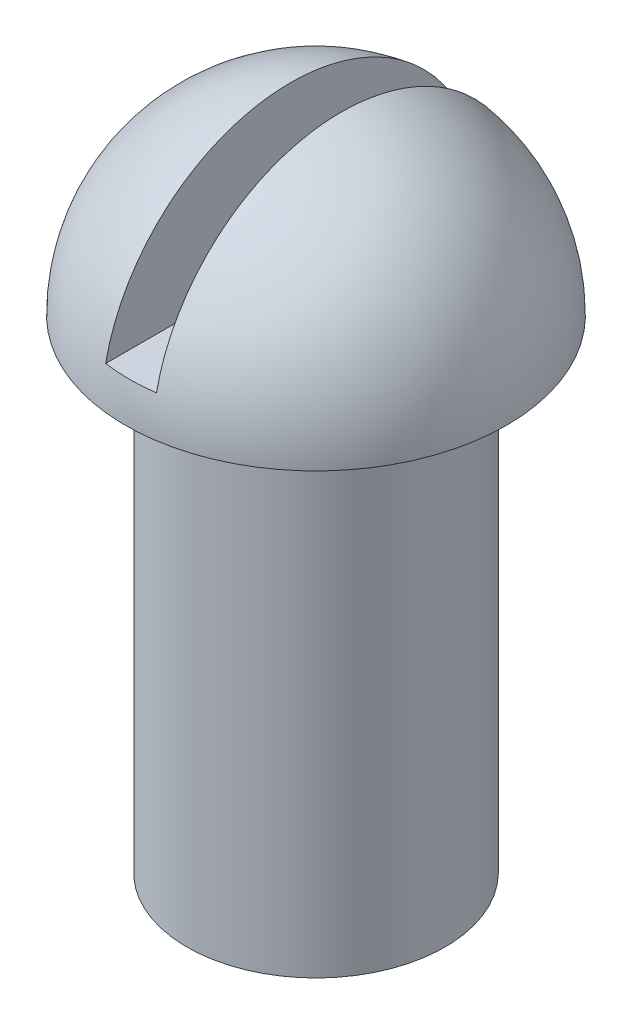
ISO-10303-21;
HEADER;
FILE_DESCRIPTION(('STEP AP214'),'2;1');
FILE_NAME('part.step','',(''),(''),'','','');
FILE_SCHEMA(('AUTOMOTIVE_DESIGN { 1 0 10303 214 1 1 1 1 }'));
ENDSEC;
DATA;
#1=APPLICATION_CONTEXT('core data for automotive mechanical design processes');
#2=APPLICATION_PROTOCOL_DEFINITION('international standard','automotive_design',2000,#1);
#3=PRODUCT_CONTEXT('',#1,'mechanical');
#4=PRODUCT('Part','Part','',(#3));
#5=PRODUCT_RELATED_PRODUCT_CATEGORY('part','',(#4));
#6=PRODUCT_DEFINITION_FORMATION('','',#4);
#7=PRODUCT_DEFINITION_CONTEXT('part definition',#1,'design');
#8=PRODUCT_DEFINITION('design','',#6,#7);
#9=PRODUCT_DEFINITION_SHAPE('','',#8);
#10=(LENGTH_UNIT() NAMED_UNIT(*) SI_UNIT(.MILLI.,.METRE.));
#11=(NAMED_UNIT(*) PLANE_ANGLE_UNIT() SI_UNIT($,.RADIAN.));
#12=(NAMED_UNIT(*) SI_UNIT($,.STERADIAN.) SOLID_ANGLE_UNIT());
#13=UNCERTAINTY_MEASURE_WITH_UNIT(LENGTH_MEASURE(1.E-05),#10,'distance_accuracy_value','');
#14=(GEOMETRIC_REPRESENTATION_CONTEXT(3) GLOBAL_UNCERTAINTY_ASSIGNED_CONTEXT((#13)) GLOBAL_UNIT_ASSIGNED_CONTEXT((#10,
#11,#12)) REPRESENTATION_CONTEXT('',''));
#15=CARTESIAN_POINT('',(0.,0.,0.));
#16=DIRECTION('',(0.,0.,1.));
#17=DIRECTION('',(1.,0.,0.));
#18=AXIS2_PLACEMENT_3D('',#15,#16,#17);
#19=CARTESIAN_POINT('',(0.,38.,0.));
#20=DIRECTION('',(0.,1.,0.));
#21=DIRECTION('',(1.,0.,0.));
#22=AXIS2_PLACEMENT_3D('',#19,#20,#21);
#23=SPHERICAL_SURFACE('',#22,15.);
#24=CARTESIAN_POINT('',(2.,38.,0.));
#25=DIRECTION('',(1.,0.,0.));
#26=DIRECTION('',(0.,0.,-1.));
#27=AXIS2_PLACEMENT_3D('',#24,#25,#26);
#28=CIRCLE('',#27,14.8660687473185);
#29=CARTESIAN_POINT('',(2.,41.,-14.560219778561));
#30=VERTEX_POINT('',#29);
#31=CARTESIAN_POINT('',(2.,41.,14.560219778561));
#32=VERTEX_POINT('',#31);
#33=EDGE_CURVE('E76',#30,#32,#28,.T.);
#34=ORIENTED_EDGE('',*,*,#33,.T.);
#35=CARTESIAN_POINT('',(0.,41.,0.));
#36=DIRECTION('',(0.,-1.,0.));
#37=DIRECTION('',(0.,0.,-1.));
#38=AXIS2_PLACEMENT_3D('',#35,#36,#37);
#39=CIRCLE('',#38,14.6969384566991);
#40=CARTESIAN_POINT('',(-2.,41.,14.560219778561));
#41=VERTEX_POINT('',#40);
#42=EDGE_CURVE('E11',#32,#41,#39,.T.);
#43=ORIENTED_EDGE('',*,*,#42,.T.);
#44=CARTESIAN_POINT('',(-2.,38.,0.));
#45=DIRECTION('',(-1.,0.,0.));
#46=DIRECTION('',(0.,0.,1.));
#47=AXIS2_PLACEMENT_3D('',#44,#45,#46);
#48=CIRCLE('',#47,14.8660687473185);
#49=CARTESIAN_POINT('',(-2.,41.,-14.560219778561));
#50=VERTEX_POINT('',#49);
#51=EDGE_CURVE('E48',#41,#50,#48,.T.);
#52=ORIENTED_EDGE('',*,*,#51,.T.);
#53=EDGE_CURVE('E55',#50,#30,#39,.T.);
#54=ORIENTED_EDGE('',*,*,#53,.T.);
#55=EDGE_LOOP('',(#34,#43,#52,#54));
#56=FACE_BOUND('',#55,.T.);
#57=CARTESIAN_POINT('',(0.,38.,0.));
#58=DIRECTION('',(0.,1.,0.));
#59=DIRECTION('',(-1.,0.,0.));
#60=AXIS2_PLACEMENT_3D('',#57,#58,#59);
#61=CIRCLE('',#60,15.);
#62=CARTESIAN_POINT('',(-15.,38.,0.));
#63=VERTEX_POINT('',#62);
#64=EDGE_CURVE('E84',#63,#63,#61,.T.);
#65=ORIENTED_EDGE('',*,*,#64,.T.);
#66=EDGE_LOOP('',(#65));
#67=FACE_BOUND('',#66,.T.);
#68=ADVANCED_FACE('F45',(#56,#67),#23,.T.);
#69=CARTESIAN_POINT('',(10.15,0.,0.));
#70=DIRECTION('',(0.,1.,0.));
#71=DIRECTION('',(-1.,0.,0.));
#72=AXIS2_PLACEMENT_3D('',#69,#70,#71);
#73=PLANE('',#72);
#74=CARTESIAN_POINT('',(0.,0.,0.));
#75=DIRECTION('',(0.,1.,0.));
#76=DIRECTION('',(-1.,0.,0.));
#77=AXIS2_PLACEMENT_3D('',#74,#75,#76);
#78=CIRCLE('',#77,10.15);
#79=CARTESIAN_POINT('',(-10.15,0.,0.));
#80=VERTEX_POINT('',#79);
#81=EDGE_CURVE('E96',#80,#80,#78,.T.);
#82=ORIENTED_EDGE('',*,*,#81,.F.);
#83=EDGE_LOOP('',(#82));
#84=FACE_BOUND('',#83,.T.);
#85=ADVANCED_FACE('F105',(#84),#73,.F.);
#86=CARTESIAN_POINT('',(0.,53.,0.));
#87=DIRECTION('',(0.,1.,0.));
#88=DIRECTION('',(-1.,0.,0.));
#89=AXIS2_PLACEMENT_3D('',#86,#87,#88);
#90=CYLINDRICAL_SURFACE('',#89,10.15);
#91=CARTESIAN_POINT('',(0.,38.,0.));
#92=DIRECTION('',(0.,1.,0.));
#93=DIRECTION('',(-1.,0.,0.));
#94=AXIS2_PLACEMENT_3D('',#91,#92,#93);
#95=CIRCLE('',#94,10.15);
#96=CARTESIAN_POINT('',(-10.15,38.,0.));
#97=VERTEX_POINT('',#96);
#98=EDGE_CURVE('E89',#97,#97,#95,.T.);
#99=ORIENTED_EDGE('',*,*,#98,.F.);
#100=EDGE_LOOP('',(#99));
#101=FACE_BOUND('',#100,.T.);
#102=ORIENTED_EDGE('',*,*,#81,.T.);
#103=EDGE_LOOP('',(#102));
#104=FACE_BOUND('',#103,.T.);
#105=ADVANCED_FACE('F103',(#101,#104),#90,.T.);
#106=CARTESIAN_POINT('',(15.,38.,0.));
#107=DIRECTION('',(0.,1.,0.));
#108=DIRECTION('',(-1.,0.,0.));
#109=AXIS2_PLACEMENT_3D('',#106,#107,#108);
#110=PLANE('',#109);
#111=ORIENTED_EDGE('',*,*,#64,.F.);
#112=EDGE_LOOP('',(#111));
#113=FACE_BOUND('',#112,.T.);
#114=ORIENTED_EDGE('',*,*,#98,.T.);
#115=EDGE_LOOP('',(#114));
#116=FACE_BOUND('',#115,.T.);
#117=ADVANCED_FACE('F110',(#113,#116),#110,.F.);
#118=CARTESIAN_POINT('',(-2.,41.,-15.));
#119=DIRECTION('',(-1.,0.,0.));
#120=DIRECTION('',(0.,0.,1.));
#121=AXIS2_PLACEMENT_3D('',#118,#119,#120);
#122=PLANE('',#121);
#123=DIRECTION('',(0.,0.,1.));
#124=VECTOR('',#123,1.);
#125=CARTESIAN_POINT('',(-2.,41.,-15.));
#126=LINE('',#125,#124);
#127=EDGE_CURVE('E81',#50,#41,#126,.T.);
#128=ORIENTED_EDGE('',*,*,#127,.F.);
#129=ORIENTED_EDGE('',*,*,#51,.F.);
#130=EDGE_LOOP('',(#128,#129));
#131=FACE_BOUND('',#130,.T.);
#132=ADVANCED_FACE('F117',(#131),#122,.F.);
#133=CARTESIAN_POINT('',(2.,41.,-15.));
#134=DIRECTION('',(1.,0.,0.));
#135=DIRECTION('',(0.,0.,-1.));
#136=AXIS2_PLACEMENT_3D('',#133,#134,#135);
#137=PLANE('',#136);
#138=DIRECTION('',(0.,0.,1.));
#139=VECTOR('',#138,1.);
#140=CARTESIAN_POINT('',(2.,41.,-15.));
#141=LINE('',#140,#139);
#142=EDGE_CURVE('E62',#30,#32,#141,.T.);
#143=ORIENTED_EDGE('',*,*,#142,.T.);
#144=ORIENTED_EDGE('',*,*,#33,.F.);
#145=EDGE_LOOP('',(#143,#144));
#146=FACE_BOUND('',#145,.T.);
#147=ADVANCED_FACE('F82',(#146),#137,.F.);
#148=CARTESIAN_POINT('',(-2.,41.,-15.));
#149=DIRECTION('',(0.,-1.,0.));
#150=DIRECTION('',(0.,0.,-1.));
#151=AXIS2_PLACEMENT_3D('',#148,#149,#150);
#152=PLANE('',#151);
#153=ORIENTED_EDGE('',*,*,#142,.F.);
#154=ORIENTED_EDGE('',*,*,#53,.F.);
#155=ORIENTED_EDGE('',*,*,#127,.T.);
#156=ORIENTED_EDGE('',*,*,#42,.F.);
#157=EDGE_LOOP('',(#153,#154,#155,#156));
#158=FACE_BOUND('',#157,.T.);
#159=ADVANCED_FACE('F80',(#158),#152,.F.);
#160=CLOSED_SHELL('',(#68,#85,#105,#117,#132,#147,#159));
#161=MANIFOLD_SOLID_BREP('B2',#160);
#162=ADVANCED_BREP_SHAPE_REPRESENTATION('',(#18,#161),#14);
#163=SHAPE_DEFINITION_REPRESENTATION(#9,#162);
ENDSEC;
END-ISO-10303-21;
